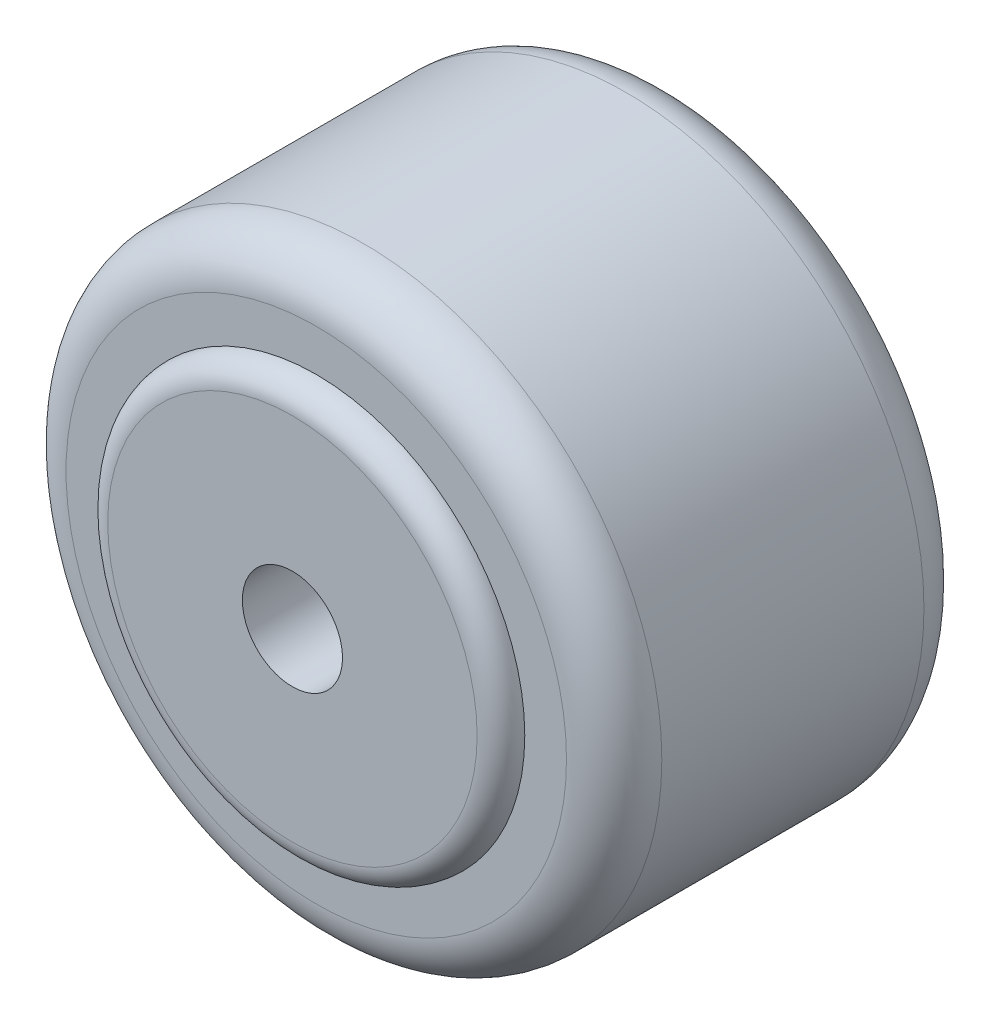
ISO-10303-21;
HEADER;
FILE_DESCRIPTION(('STEP AP214'),'2;1');
FILE_NAME('part.step','',(''),(''),'','','');
FILE_SCHEMA(('AUTOMOTIVE_DESIGN { 1 0 10303 214 1 1 1 1 }'));
ENDSEC;
DATA;
#1=APPLICATION_CONTEXT('core data for automotive mechanical design processes');
#2=APPLICATION_PROTOCOL_DEFINITION('international standard','automotive_design',2000,#1);
#3=PRODUCT_CONTEXT('',#1,'mechanical');
#4=PRODUCT('Part','Part','',(#3));
#5=PRODUCT_RELATED_PRODUCT_CATEGORY('part','',(#4));
#6=PRODUCT_DEFINITION_FORMATION('','',#4);
#7=PRODUCT_DEFINITION_CONTEXT('part definition',#1,'design');
#8=PRODUCT_DEFINITION('design','',#6,#7);
#9=PRODUCT_DEFINITION_SHAPE('','',#8);
#10=(LENGTH_UNIT() NAMED_UNIT(*) SI_UNIT(.MILLI.,.METRE.));
#11=(NAMED_UNIT(*) PLANE_ANGLE_UNIT() SI_UNIT($,.RADIAN.));
#12=(NAMED_UNIT(*) SI_UNIT($,.STERADIAN.) SOLID_ANGLE_UNIT());
#13=UNCERTAINTY_MEASURE_WITH_UNIT(LENGTH_MEASURE(1.E-05),#10,'distance_accuracy_value','');
#14=(GEOMETRIC_REPRESENTATION_CONTEXT(3) GLOBAL_UNCERTAINTY_ASSIGNED_CONTEXT((#13)) GLOBAL_UNIT_ASSIGNED_CONTEXT((#10,
#11,#12)) REPRESENTATION_CONTEXT('',''));
#15=CARTESIAN_POINT('',(0.,0.,0.));
#16=DIRECTION('',(0.,0.,1.));
#17=DIRECTION('',(1.,0.,0.));
#18=AXIS2_PLACEMENT_3D('',#15,#16,#17);
#19=CARTESIAN_POINT('',(0.,0.,0.));
#20=DIRECTION('',(0.,0.,1.));
#21=DIRECTION('',(1.,0.,0.));
#22=AXIS2_PLACEMENT_3D('',#19,#20,#21);
#23=PLANE('',#22);
#24=CARTESIAN_POINT('',(0.,0.,0.));
#25=DIRECTION('',(0.,0.,1.));
#26=DIRECTION('',(1.,0.,0.));
#27=AXIS2_PLACEMENT_3D('',#24,#25,#26);
#28=CIRCLE('',#27,21.);
#29=CARTESIAN_POINT('',(21.,0.,0.));
#30=VERTEX_POINT('',#29);
#31=EDGE_CURVE('E50',#30,#30,#28,.F.);
#32=ORIENTED_EDGE('',*,*,#31,.T.);
#33=EDGE_LOOP('',(#32));
#34=FACE_BOUND('',#33,.T.);
#35=CARTESIAN_POINT('',(0.,0.,0.));
#36=DIRECTION('',(0.,0.,1.));
#37=DIRECTION('',(1.,0.,0.));
#38=AXIS2_PLACEMENT_3D('',#35,#36,#37);
#39=CIRCLE('',#38,17.5);
#40=CARTESIAN_POINT('',(17.5,0.,0.));
#41=VERTEX_POINT('',#40);
#42=EDGE_CURVE('E42',#41,#41,#39,.F.);
#43=ORIENTED_EDGE('',*,*,#42,.F.);
#44=EDGE_LOOP('',(#43));
#45=FACE_BOUND('',#44,.T.);
#46=ADVANCED_FACE('F35',(#34,#45),#23,.F.);
#47=CARTESIAN_POINT('',(0.,0.,30.));
#48=DIRECTION('',(0.,0.,1.));
#49=DIRECTION('',(1.,0.,0.));
#50=AXIS2_PLACEMENT_3D('',#47,#48,#49);
#51=PLANE('',#50);
#52=CARTESIAN_POINT('',(0.,0.,30.));
#53=DIRECTION('',(0.,0.,1.));
#54=DIRECTION('',(1.,0.,0.));
#55=AXIS2_PLACEMENT_3D('',#52,#53,#54);
#56=CIRCLE('',#55,21.);
#57=CARTESIAN_POINT('',(21.,0.,30.));
#58=VERTEX_POINT('',#57);
#59=EDGE_CURVE('E61',#58,#58,#56,.T.);
#60=ORIENTED_EDGE('',*,*,#59,.T.);
#61=EDGE_LOOP('',(#60));
#62=FACE_BOUND('',#61,.T.);
#63=CARTESIAN_POINT('',(0.,0.,30.));
#64=DIRECTION('',(0.,0.,1.));
#65=DIRECTION('',(1.,0.,0.));
#66=AXIS2_PLACEMENT_3D('',#63,#64,#65);
#67=CIRCLE('',#66,17.5);
#68=CARTESIAN_POINT('',(17.5,0.,30.));
#69=VERTEX_POINT('',#68);
#70=EDGE_CURVE('E64',#69,#69,#67,.T.);
#71=ORIENTED_EDGE('',*,*,#70,.F.);
#72=EDGE_LOOP('',(#71));
#73=FACE_BOUND('',#72,.T.);
#74=ADVANCED_FACE('F94',(#62,#73),#51,.T.);
#75=CARTESIAN_POINT('',(0.,0.,30.));
#76=DIRECTION('',(0.,0.,-1.));
#77=DIRECTION('',(-1.,0.,0.));
#78=AXIS2_PLACEMENT_3D('',#75,#76,#77);
#79=CYLINDRICAL_SURFACE('',#78,25.);
#80=CARTESIAN_POINT('',(0.,0.,4.));
#81=DIRECTION('',(0.,0.,1.));
#82=DIRECTION('',(1.,0.,0.));
#83=AXIS2_PLACEMENT_3D('',#80,#81,#82);
#84=CIRCLE('',#83,25.);
#85=CARTESIAN_POINT('',(25.,0.,4.));
#86=VERTEX_POINT('',#85);
#87=EDGE_CURVE('E55',#86,#86,#84,.T.);
#88=ORIENTED_EDGE('',*,*,#87,.T.);
#89=EDGE_LOOP('',(#88));
#90=FACE_BOUND('',#89,.T.);
#91=CARTESIAN_POINT('',(0.,0.,26.));
#92=DIRECTION('',(0.,0.,1.));
#93=DIRECTION('',(1.,0.,0.));
#94=AXIS2_PLACEMENT_3D('',#91,#92,#93);
#95=CIRCLE('',#94,25.);
#96=CARTESIAN_POINT('',(25.,0.,26.));
#97=VERTEX_POINT('',#96);
#98=EDGE_CURVE('E58',#97,#97,#95,.F.);
#99=ORIENTED_EDGE('',*,*,#98,.T.);
#100=EDGE_LOOP('',(#99));
#101=FACE_BOUND('',#100,.T.);
#102=ADVANCED_FACE('F100',(#90,#101),#79,.T.);
#103=CARTESIAN_POINT('',(0.,0.,26.));
#104=DIRECTION('',(0.,0.,1.));
#105=DIRECTION('',(1.,0.,0.));
#106=AXIS2_PLACEMENT_3D('',#103,#104,#105);
#107=TOROIDAL_SURFACE('',#106,21.,4.);
#108=ORIENTED_EDGE('',*,*,#98,.F.);
#109=EDGE_LOOP('',(#108));
#110=FACE_BOUND('',#109,.T.);
#111=ORIENTED_EDGE('',*,*,#59,.F.);
#112=EDGE_LOOP('',(#111));
#113=FACE_BOUND('',#112,.T.);
#114=ADVANCED_FACE('F107',(#110,#113),#107,.T.);
#115=CARTESIAN_POINT('',(0.,0.,4.));
#116=DIRECTION('',(0.,0.,1.));
#117=DIRECTION('',(1.,0.,0.));
#118=AXIS2_PLACEMENT_3D('',#115,#116,#117);
#119=TOROIDAL_SURFACE('',#118,21.,4.);
#120=ORIENTED_EDGE('',*,*,#31,.F.);
#121=EDGE_LOOP('',(#120));
#122=FACE_BOUND('',#121,.T.);
#123=ORIENTED_EDGE('',*,*,#87,.F.);
#124=EDGE_LOOP('',(#123));
#125=FACE_BOUND('',#124,.T.);
#126=ADVANCED_FACE('F111',(#122,#125),#119,.T.);
#127=CARTESIAN_POINT('',(0.,0.,32.));
#128=DIRECTION('',(0.,0.,1.));
#129=DIRECTION('',(1.,0.,0.));
#130=AXIS2_PLACEMENT_3D('',#127,#128,#129);
#131=PLANE('',#130);
#132=CARTESIAN_POINT('',(0.,0.,32.));
#133=DIRECTION('',(0.,0.,-1.));
#134=DIRECTION('',(-1.,0.,0.));
#135=AXIS2_PLACEMENT_3D('',#132,#133,#134);
#136=CIRCLE('',#135,4.2);
#137=CARTESIAN_POINT('',(-4.2,0.,32.));
#138=VERTEX_POINT('',#137);
#139=EDGE_CURVE('E67',#138,#138,#136,.T.);
#140=ORIENTED_EDGE('',*,*,#139,.T.);
#141=EDGE_LOOP('',(#140));
#142=FACE_BOUND('',#141,.T.);
#143=CARTESIAN_POINT('',(0.,0.,32.));
#144=DIRECTION('',(0.,0.,1.));
#145=DIRECTION('',(1.,0.,0.));
#146=AXIS2_PLACEMENT_3D('',#143,#144,#145);
#147=CIRCLE('',#146,15.5);
#148=CARTESIAN_POINT('',(15.5,0.,32.));
#149=VERTEX_POINT('',#148);
#150=EDGE_CURVE('E46',#149,#149,#147,.T.);
#151=ORIENTED_EDGE('',*,*,#150,.T.);
#152=EDGE_LOOP('',(#151));
#153=FACE_BOUND('',#152,.T.);
#154=ADVANCED_FACE('F74',(#142,#153),#131,.T.);
#155=CARTESIAN_POINT('',(0.,0.,30.));
#156=DIRECTION('',(0.,0.,1.));
#157=DIRECTION('',(1.,0.,0.));
#158=AXIS2_PLACEMENT_3D('',#155,#156,#157);
#159=TOROIDAL_SURFACE('',#158,15.5,2.);
#160=ORIENTED_EDGE('',*,*,#70,.T.);
#161=EDGE_LOOP('',(#160));
#162=FACE_BOUND('',#161,.T.);
#163=ORIENTED_EDGE('',*,*,#150,.F.);
#164=EDGE_LOOP('',(#163));
#165=FACE_BOUND('',#164,.T.);
#166=ADVANCED_FACE('F85',(#162,#165),#159,.T.);
#167=CARTESIAN_POINT('',(0.,0.,-2.));
#168=DIRECTION('',(0.,0.,-1.));
#169=DIRECTION('',(-1.,0.,0.));
#170=AXIS2_PLACEMENT_3D('',#167,#168,#169);
#171=PLANE('',#170);
#172=CARTESIAN_POINT('',(0.,0.,-2.));
#173=DIRECTION('',(0.,0.,-1.));
#174=DIRECTION('',(-1.,0.,0.));
#175=AXIS2_PLACEMENT_3D('',#172,#173,#174);
#176=CIRCLE('',#175,4.2);
#177=CARTESIAN_POINT('',(-4.2,0.,-2.));
#178=VERTEX_POINT('',#177);
#179=EDGE_CURVE('E68',#178,#178,#176,.T.);
#180=ORIENTED_EDGE('',*,*,#179,.F.);
#181=EDGE_LOOP('',(#180));
#182=FACE_BOUND('',#181,.T.);
#183=CARTESIAN_POINT('',(0.,0.,-2.));
#184=DIRECTION('',(0.,0.,-1.));
#185=DIRECTION('',(-1.,0.,0.));
#186=AXIS2_PLACEMENT_3D('',#183,#184,#185);
#187=CIRCLE('',#186,15.5);
#188=CARTESIAN_POINT('',(-15.5,0.,-2.));
#189=VERTEX_POINT('',#188);
#190=EDGE_CURVE('E10',#189,#189,#187,.T.);
#191=ORIENTED_EDGE('',*,*,#190,.T.);
#192=EDGE_LOOP('',(#191));
#193=FACE_BOUND('',#192,.T.);
#194=ADVANCED_FACE('F83',(#182,#193),#171,.T.);
#195=CARTESIAN_POINT('',(0.,0.,0.));
#196=DIRECTION('',(0.,0.,-1.));
#197=DIRECTION('',(-1.,0.,0.));
#198=AXIS2_PLACEMENT_3D('',#195,#196,#197);
#199=TOROIDAL_SURFACE('',#198,15.5,2.);
#200=ORIENTED_EDGE('',*,*,#42,.T.);
#201=EDGE_LOOP('',(#200));
#202=FACE_BOUND('',#201,.T.);
#203=ORIENTED_EDGE('',*,*,#190,.F.);
#204=EDGE_LOOP('',(#203));
#205=FACE_BOUND('',#204,.T.);
#206=ADVANCED_FACE('F37',(#202,#205),#199,.T.);
#207=CARTESIAN_POINT('',(0.,0.,32.));
#208=DIRECTION('',(0.,0.,-1.));
#209=DIRECTION('',(-1.,0.,0.));
#210=AXIS2_PLACEMENT_3D('',#207,#208,#209);
#211=CYLINDRICAL_SURFACE('',#210,4.2);
#212=ORIENTED_EDGE('',*,*,#139,.F.);
#213=EDGE_LOOP('',(#212));
#214=FACE_BOUND('',#213,.T.);
#215=ORIENTED_EDGE('',*,*,#179,.T.);
#216=EDGE_LOOP('',(#215));
#217=FACE_BOUND('',#216,.T.);
#218=ADVANCED_FACE('F77',(#214,#217),#211,.F.);
#219=CLOSED_SHELL('',(#46,#74,#102,#114,#126,#154,#166,#194,#206,#218));
#220=MANIFOLD_SOLID_BREP('B2',#219);
#221=ADVANCED_BREP_SHAPE_REPRESENTATION('',(#18,#220),#14);
#222=SHAPE_DEFINITION_REPRESENTATION(#9,#221);
ENDSEC;
END-ISO-10303-21;
